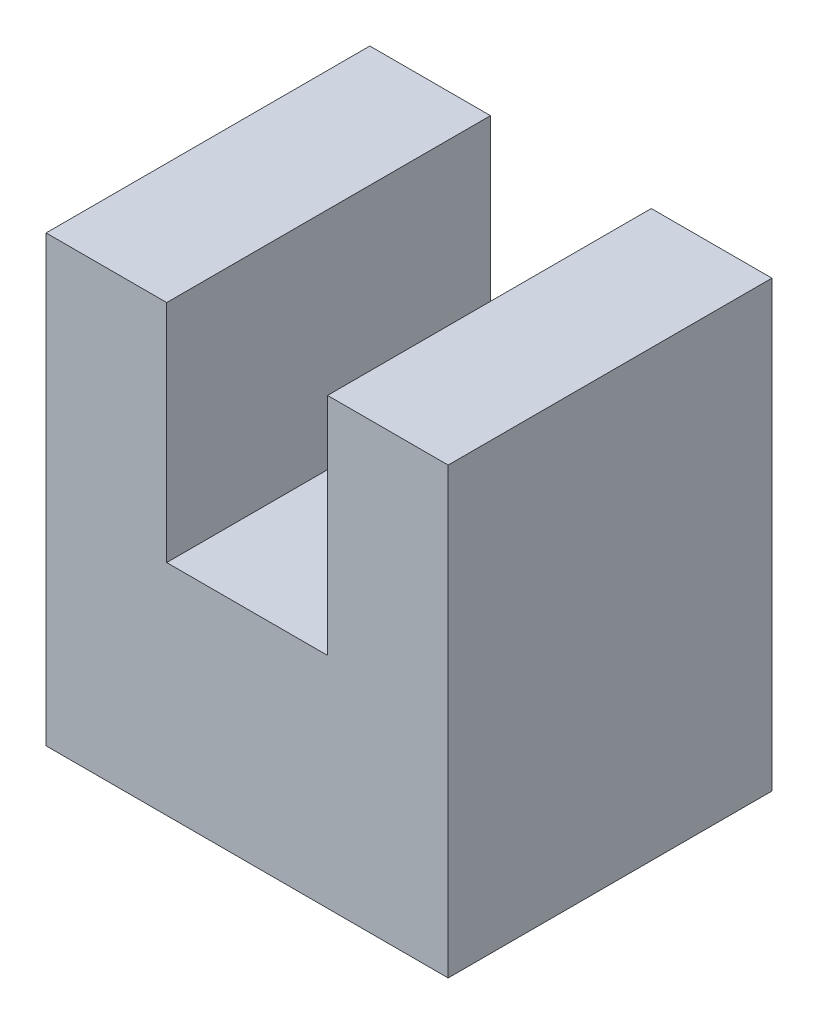
ISO-10303-21;
HEADER;
FILE_DESCRIPTION(('STEP AP214'),'2;1');
FILE_NAME('part.step','',(''),(''),'','','');
FILE_SCHEMA(('AUTOMOTIVE_DESIGN { 1 0 10303 214 1 1 1 1 }'));
ENDSEC;
DATA;
#1=APPLICATION_CONTEXT('core data for automotive mechanical design processes');
#2=APPLICATION_PROTOCOL_DEFINITION('international standard','automotive_design',2000,#1);
#3=PRODUCT_CONTEXT('',#1,'mechanical');
#4=PRODUCT('Part','Part','',(#3));
#5=PRODUCT_RELATED_PRODUCT_CATEGORY('part','',(#4));
#6=PRODUCT_DEFINITION_FORMATION('','',#4);
#7=PRODUCT_DEFINITION_CONTEXT('part definition',#1,'design');
#8=PRODUCT_DEFINITION('design','',#6,#7);
#9=PRODUCT_DEFINITION_SHAPE('','',#8);
#10=(LENGTH_UNIT() NAMED_UNIT(*) SI_UNIT(.MILLI.,.METRE.));
#11=(NAMED_UNIT(*) PLANE_ANGLE_UNIT() SI_UNIT($,.RADIAN.));
#12=(NAMED_UNIT(*) SI_UNIT($,.STERADIAN.) SOLID_ANGLE_UNIT());
#13=UNCERTAINTY_MEASURE_WITH_UNIT(LENGTH_MEASURE(1.E-05),#10,'distance_accuracy_value','');
#14=(GEOMETRIC_REPRESENTATION_CONTEXT(3) GLOBAL_UNCERTAINTY_ASSIGNED_CONTEXT((#13)) GLOBAL_UNIT_ASSIGNED_CONTEXT((#10,
#11,#12)) REPRESENTATION_CONTEXT('',''));
#15=CARTESIAN_POINT('',(0.,0.,0.));
#16=DIRECTION('',(0.,0.,1.));
#17=DIRECTION('',(1.,0.,0.));
#18=AXIS2_PLACEMENT_3D('',#15,#16,#17);
#19=CARTESIAN_POINT('',(1.,0.,4.0259));
#20=DIRECTION('',(-1.,0.,0.));
#21=DIRECTION('',(0.,-1.,0.));
#22=AXIS2_PLACEMENT_3D('',#19,#20,#21);
#23=PLANE('',#22);
#24=DIRECTION('',(0.,1.,0.));
#25=VECTOR('',#24,1.);
#26=CARTESIAN_POINT('',(1.,0.,0.));
#27=LINE('',#26,#25);
#28=CARTESIAN_POINT('',(1.,1.962,0.));
#29=VERTEX_POINT('',#28);
#30=CARTESIAN_POINT('',(1.,4.762,0.));
#31=VERTEX_POINT('',#30);
#32=EDGE_CURVE('E129',#29,#31,#27,.T.);
#33=ORIENTED_EDGE('',*,*,#32,.F.);
#34=DIRECTION('',(0.,0.,-1.));
#35=VECTOR('',#34,1.);
#36=CARTESIAN_POINT('',(1.,1.962,4.0259));
#37=LINE('',#36,#35);
#38=CARTESIAN_POINT('',(1.,1.962,4.0259));
#39=VERTEX_POINT('',#38);
#40=EDGE_CURVE('E11',#39,#29,#37,.T.);
#41=ORIENTED_EDGE('',*,*,#40,.F.);
#42=DIRECTION('',(0.,1.,0.));
#43=VECTOR('',#42,1.);
#44=CARTESIAN_POINT('',(1.,0.,4.0259));
#45=LINE('',#44,#43);
#46=CARTESIAN_POINT('',(1.,4.762,4.0259));
#47=VERTEX_POINT('',#46);
#48=EDGE_CURVE('E173',#39,#47,#45,.T.);
#49=ORIENTED_EDGE('',*,*,#48,.T.);
#50=DIRECTION('',(0.,0.,-1.));
#51=VECTOR('',#50,1.);
#52=CARTESIAN_POINT('',(1.,4.762,4.0259));
#53=LINE('',#52,#51);
#54=EDGE_CURVE('E51',#47,#31,#53,.T.);
#55=ORIENTED_EDGE('',*,*,#54,.T.);
#56=EDGE_LOOP('',(#33,#41,#49,#55));
#57=FACE_BOUND('',#56,.T.);
#58=ADVANCED_FACE('F35',(#57),#23,.T.);
#59=CARTESIAN_POINT('',(0.,1.962,4.0259));
#60=DIRECTION('',(0.,1.,0.));
#61=DIRECTION('',(0.,0.,1.));
#62=AXIS2_PLACEMENT_3D('',#59,#60,#61);
#63=PLANE('',#62);
#64=DIRECTION('',(1.,0.,0.));
#65=VECTOR('',#64,1.);
#66=CARTESIAN_POINT('',(0.,1.962,0.));
#67=LINE('',#66,#65);
#68=CARTESIAN_POINT('',(-1.,1.962,0.));
#69=VERTEX_POINT('',#68);
#70=EDGE_CURVE('E131',#69,#29,#67,.T.);
#71=ORIENTED_EDGE('',*,*,#70,.F.);
#72=DIRECTION('',(0.,0.,-1.));
#73=VECTOR('',#72,1.);
#74=CARTESIAN_POINT('',(-1.,1.962,4.0259));
#75=LINE('',#74,#73);
#76=CARTESIAN_POINT('',(-1.,1.962,4.0259));
#77=VERTEX_POINT('',#76);
#78=EDGE_CURVE('E43',#77,#69,#75,.T.);
#79=ORIENTED_EDGE('',*,*,#78,.F.);
#80=DIRECTION('',(1.,0.,0.));
#81=VECTOR('',#80,1.);
#82=CARTESIAN_POINT('',(0.,1.962,4.0259));
#83=LINE('',#82,#81);
#84=EDGE_CURVE('E171',#77,#39,#83,.T.);
#85=ORIENTED_EDGE('',*,*,#84,.T.);
#86=ORIENTED_EDGE('',*,*,#40,.T.);
#87=EDGE_LOOP('',(#71,#79,#85,#86));
#88=FACE_BOUND('',#87,.T.);
#89=ADVANCED_FACE('F163',(#88),#63,.T.);
#90=CARTESIAN_POINT('',(-1.,0.,4.0259));
#91=DIRECTION('',(1.,0.,0.));
#92=DIRECTION('',(0.,1.,0.));
#93=AXIS2_PLACEMENT_3D('',#90,#91,#92);
#94=PLANE('',#93);
#95=DIRECTION('',(0.,-1.,0.));
#96=VECTOR('',#95,1.);
#97=CARTESIAN_POINT('',(-1.,0.,0.));
#98=LINE('',#97,#96);
#99=CARTESIAN_POINT('',(-1.,4.762,0.));
#100=VERTEX_POINT('',#99);
#101=EDGE_CURVE('E134',#100,#69,#98,.T.);
#102=ORIENTED_EDGE('',*,*,#101,.F.);
#103=DIRECTION('',(0.,0.,-1.));
#104=VECTOR('',#103,1.);
#105=CARTESIAN_POINT('',(-1.,4.762,4.0259));
#106=LINE('',#105,#104);
#107=CARTESIAN_POINT('',(-1.,4.762,4.0259));
#108=VERTEX_POINT('',#107);
#109=EDGE_CURVE('E152',#108,#100,#106,.T.);
#110=ORIENTED_EDGE('',*,*,#109,.F.);
#111=DIRECTION('',(0.,-1.,0.));
#112=VECTOR('',#111,1.);
#113=CARTESIAN_POINT('',(-1.,0.,4.0259));
#114=LINE('',#113,#112);
#115=EDGE_CURVE('E159',#108,#77,#114,.T.);
#116=ORIENTED_EDGE('',*,*,#115,.T.);
#117=ORIENTED_EDGE('',*,*,#78,.T.);
#118=EDGE_LOOP('',(#102,#110,#116,#117));
#119=FACE_BOUND('',#118,.T.);
#120=ADVANCED_FACE('F157',(#119),#94,.T.);
#121=CARTESIAN_POINT('',(0.,4.762,4.0259));
#122=DIRECTION('',(0.,1.,0.));
#123=DIRECTION('',(-1.,0.,0.));
#124=AXIS2_PLACEMENT_3D('',#121,#122,#123);
#125=PLANE('',#124);
#126=DIRECTION('',(1.,0.,0.));
#127=VECTOR('',#126,1.);
#128=CARTESIAN_POINT('',(0.,4.762,0.));
#129=LINE('',#128,#127);
#130=CARTESIAN_POINT('',(-2.5,4.762,0.));
#131=VERTEX_POINT('',#130);
#132=EDGE_CURVE('E137',#131,#100,#129,.T.);
#133=ORIENTED_EDGE('',*,*,#132,.F.);
#134=DIRECTION('',(0.,0.,-1.));
#135=VECTOR('',#134,1.);
#136=CARTESIAN_POINT('',(-2.5,4.762,4.0259));
#137=LINE('',#136,#135);
#138=CARTESIAN_POINT('',(-2.5,4.762,4.0259));
#139=VERTEX_POINT('',#138);
#140=EDGE_CURVE('E150',#139,#131,#137,.T.);
#141=ORIENTED_EDGE('',*,*,#140,.F.);
#142=DIRECTION('',(1.,0.,0.));
#143=VECTOR('',#142,1.);
#144=CARTESIAN_POINT('',(0.,4.762,4.0259));
#145=LINE('',#144,#143);
#146=EDGE_CURVE('E125',#139,#108,#145,.T.);
#147=ORIENTED_EDGE('',*,*,#146,.T.);
#148=ORIENTED_EDGE('',*,*,#109,.T.);
#149=EDGE_LOOP('',(#133,#141,#147,#148));
#150=FACE_BOUND('',#149,.T.);
#151=ADVANCED_FACE('F169',(#150),#125,.T.);
#152=CARTESIAN_POINT('',(-2.5,0.,4.0259));
#153=DIRECTION('',(-1.,0.,0.));
#154=DIRECTION('',(0.,0.,1.));
#155=AXIS2_PLACEMENT_3D('',#152,#153,#154);
#156=PLANE('',#155);
#157=DIRECTION('',(0.,1.,0.));
#158=VECTOR('',#157,1.);
#159=CARTESIAN_POINT('',(-2.5,0.,0.));
#160=LINE('',#159,#158);
#161=CARTESIAN_POINT('',(-2.5,-0.762,0.));
#162=VERTEX_POINT('',#161);
#163=EDGE_CURVE('E140',#162,#131,#160,.T.);
#164=ORIENTED_EDGE('',*,*,#163,.F.);
#165=DIRECTION('',(0.,0.,-1.));
#166=VECTOR('',#165,1.);
#167=CARTESIAN_POINT('',(-2.5,-0.762,4.0259));
#168=LINE('',#167,#166);
#169=CARTESIAN_POINT('',(-2.5,-0.762,4.0259));
#170=VERTEX_POINT('',#169);
#171=EDGE_CURVE('E111',#170,#162,#168,.T.);
#172=ORIENTED_EDGE('',*,*,#171,.F.);
#173=DIRECTION('',(0.,1.,0.));
#174=VECTOR('',#173,1.);
#175=CARTESIAN_POINT('',(-2.5,0.,4.0259));
#176=LINE('',#175,#174);
#177=EDGE_CURVE('E123',#170,#139,#176,.T.);
#178=ORIENTED_EDGE('',*,*,#177,.T.);
#179=ORIENTED_EDGE('',*,*,#140,.T.);
#180=EDGE_LOOP('',(#164,#172,#178,#179));
#181=FACE_BOUND('',#180,.T.);
#182=ADVANCED_FACE('F188',(#181),#156,.T.);
#183=CARTESIAN_POINT('',(0.,-0.762,4.0259));
#184=DIRECTION('',(0.,-1.,0.));
#185=DIRECTION('',(1.,0.,0.));
#186=AXIS2_PLACEMENT_3D('',#183,#184,#185);
#187=PLANE('',#186);
#188=DIRECTION('',(-1.,0.,0.));
#189=VECTOR('',#188,1.);
#190=CARTESIAN_POINT('',(0.,-0.762,0.));
#191=LINE('',#190,#189);
#192=CARTESIAN_POINT('',(2.5,-0.762,0.));
#193=VERTEX_POINT('',#192);
#194=EDGE_CURVE('E108',#193,#162,#191,.T.);
#195=ORIENTED_EDGE('',*,*,#194,.F.);
#196=DIRECTION('',(0.,0.,-1.));
#197=VECTOR('',#196,1.);
#198=CARTESIAN_POINT('',(2.5,-0.762,4.0259));
#199=LINE('',#198,#197);
#200=CARTESIAN_POINT('',(2.5,-0.762,4.0259));
#201=VERTEX_POINT('',#200);
#202=EDGE_CURVE('E102',#201,#193,#199,.T.);
#203=ORIENTED_EDGE('',*,*,#202,.F.);
#204=DIRECTION('',(-1.,0.,0.));
#205=VECTOR('',#204,1.);
#206=CARTESIAN_POINT('',(0.,-0.762,4.0259));
#207=LINE('',#206,#205);
#208=EDGE_CURVE('E106',#201,#170,#207,.T.);
#209=ORIENTED_EDGE('',*,*,#208,.T.);
#210=ORIENTED_EDGE('',*,*,#171,.T.);
#211=EDGE_LOOP('',(#195,#203,#209,#210));
#212=FACE_BOUND('',#211,.T.);
#213=ADVANCED_FACE('F104',(#212),#187,.T.);
#214=CARTESIAN_POINT('',(2.5,0.,4.0259));
#215=DIRECTION('',(-1.,0.,0.));
#216=DIRECTION('',(0.,0.,1.));
#217=AXIS2_PLACEMENT_3D('',#214,#215,#216);
#218=PLANE('',#217);
#219=DIRECTION('',(0.,1.,0.));
#220=VECTOR('',#219,1.);
#221=CARTESIAN_POINT('',(2.5,0.,0.));
#222=LINE('',#221,#220);
#223=CARTESIAN_POINT('',(2.5,4.762,0.));
#224=VERTEX_POINT('',#223);
#225=EDGE_CURVE('E145',#193,#224,#222,.T.);
#226=ORIENTED_EDGE('',*,*,#225,.T.);
#227=DIRECTION('',(0.,0.,-1.));
#228=VECTOR('',#227,1.);
#229=CARTESIAN_POINT('',(2.5,4.762,4.0259));
#230=LINE('',#229,#228);
#231=CARTESIAN_POINT('',(2.5,4.762,4.0259));
#232=VERTEX_POINT('',#231);
#233=EDGE_CURVE('E77',#232,#224,#230,.T.);
#234=ORIENTED_EDGE('',*,*,#233,.F.);
#235=DIRECTION('',(0.,1.,0.));
#236=VECTOR('',#235,1.);
#237=CARTESIAN_POINT('',(2.5,0.,4.0259));
#238=LINE('',#237,#236);
#239=EDGE_CURVE('E113',#201,#232,#238,.T.);
#240=ORIENTED_EDGE('',*,*,#239,.F.);
#241=ORIENTED_EDGE('',*,*,#202,.T.);
#242=EDGE_LOOP('',(#226,#234,#240,#241));
#243=FACE_BOUND('',#242,.T.);
#244=ADVANCED_FACE('F114',(#243),#218,.F.);
#245=EDGE_CURVE('E141',#31,#224,#129,.T.);
#246=ORIENTED_EDGE('',*,*,#245,.F.);
#247=ORIENTED_EDGE('',*,*,#54,.F.);
#248=EDGE_CURVE('E117',#47,#232,#145,.T.);
#249=ORIENTED_EDGE('',*,*,#248,.T.);
#250=ORIENTED_EDGE('',*,*,#233,.T.);
#251=EDGE_LOOP('',(#246,#247,#249,#250));
#252=FACE_BOUND('',#251,.T.);
#253=ADVANCED_FACE('F177',(#252),#125,.T.);
#254=CARTESIAN_POINT('',(0.,0.,4.0259));
#255=DIRECTION('',(0.,0.,1.));
#256=DIRECTION('',(1.,0.,0.));
#257=AXIS2_PLACEMENT_3D('',#254,#255,#256);
#258=PLANE('',#257);
#259=ORIENTED_EDGE('',*,*,#48,.F.);
#260=ORIENTED_EDGE('',*,*,#84,.F.);
#261=ORIENTED_EDGE('',*,*,#115,.F.);
#262=ORIENTED_EDGE('',*,*,#146,.F.);
#263=ORIENTED_EDGE('',*,*,#177,.F.);
#264=ORIENTED_EDGE('',*,*,#208,.F.);
#265=ORIENTED_EDGE('',*,*,#239,.T.);
#266=ORIENTED_EDGE('',*,*,#248,.F.);
#267=EDGE_LOOP('',(#259,#260,#261,#262,#263,#264,#265,#266));
#268=FACE_BOUND('',#267,.T.);
#269=ADVANCED_FACE('F120',(#268),#258,.T.);
#270=CARTESIAN_POINT('',(0.,0.,0.));
#271=DIRECTION('',(0.,0.,1.));
#272=DIRECTION('',(1.,0.,0.));
#273=AXIS2_PLACEMENT_3D('',#270,#271,#272);
#274=PLANE('',#273);
#275=ORIENTED_EDGE('',*,*,#32,.T.);
#276=ORIENTED_EDGE('',*,*,#245,.T.);
#277=ORIENTED_EDGE('',*,*,#225,.F.);
#278=ORIENTED_EDGE('',*,*,#194,.T.);
#279=ORIENTED_EDGE('',*,*,#163,.T.);
#280=ORIENTED_EDGE('',*,*,#132,.T.);
#281=ORIENTED_EDGE('',*,*,#101,.T.);
#282=ORIENTED_EDGE('',*,*,#70,.T.);
#283=EDGE_LOOP('',(#275,#276,#277,#278,#279,#280,#281,#282));
#284=FACE_BOUND('',#283,.T.);
#285=ADVANCED_FACE('F165',(#284),#274,.F.);
#286=CLOSED_SHELL('',(#58,#89,#120,#151,#182,#213,#244,#253,#269,#285));
#287=MANIFOLD_SOLID_BREP('B2',#286);
#288=ADVANCED_BREP_SHAPE_REPRESENTATION('',(#18,#287),#14);
#289=SHAPE_DEFINITION_REPRESENTATION(#9,#288);
ENDSEC;
END-ISO-10303-21;
